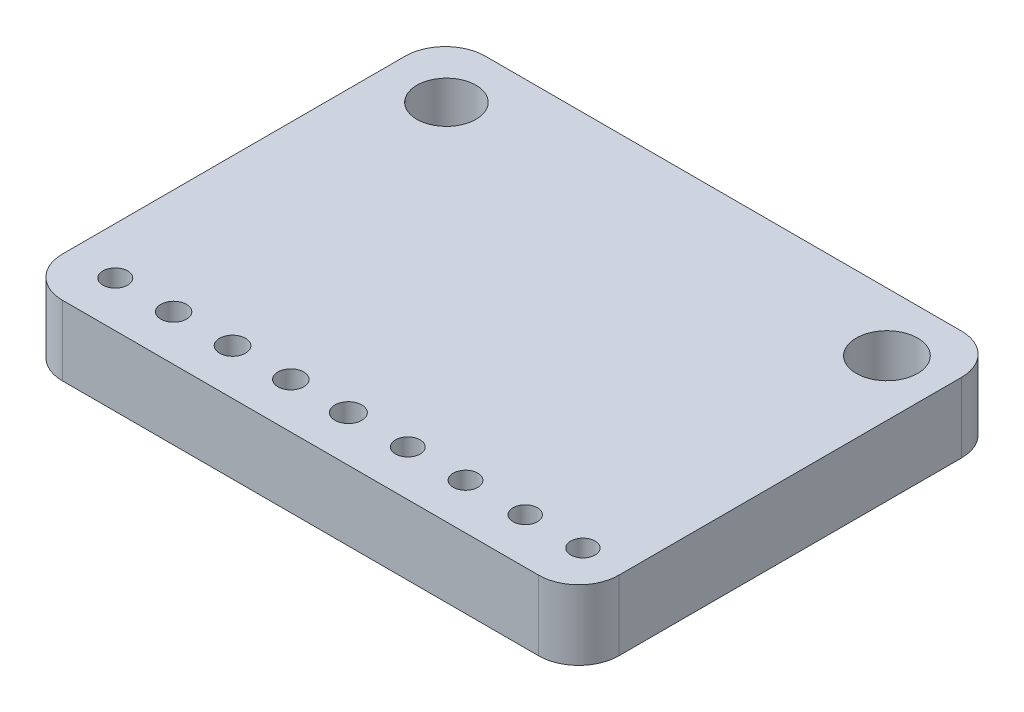
ISO-10303-21;
HEADER;
FILE_DESCRIPTION(('STEP AP214'),'2;1');
FILE_NAME('part.step','',(''),(''),'','','');
FILE_SCHEMA(('AUTOMOTIVE_DESIGN { 1 0 10303 214 1 1 1 1 }'));
ENDSEC;
DATA;
#1=APPLICATION_CONTEXT('core data for automotive mechanical design processes');
#2=APPLICATION_PROTOCOL_DEFINITION('international standard','automotive_design',2000,#1);
#3=PRODUCT_CONTEXT('',#1,'mechanical');
#4=PRODUCT('Part','Part','',(#3));
#5=PRODUCT_RELATED_PRODUCT_CATEGORY('part','',(#4));
#6=PRODUCT_DEFINITION_FORMATION('','',#4);
#7=PRODUCT_DEFINITION_CONTEXT('part definition',#1,'design');
#8=PRODUCT_DEFINITION('design','',#6,#7);
#9=PRODUCT_DEFINITION_SHAPE('','',#8);
#10=(LENGTH_UNIT() NAMED_UNIT(*) SI_UNIT(.MILLI.,.METRE.));
#11=(NAMED_UNIT(*) PLANE_ANGLE_UNIT() SI_UNIT($,.RADIAN.));
#12=(NAMED_UNIT(*) SI_UNIT($,.STERADIAN.) SOLID_ANGLE_UNIT());
#13=UNCERTAINTY_MEASURE_WITH_UNIT(LENGTH_MEASURE(1.E-05),#10,'distance_accuracy_value','');
#14=(GEOMETRIC_REPRESENTATION_CONTEXT(3) GLOBAL_UNCERTAINTY_ASSIGNED_CONTEXT((#13)) GLOBAL_UNIT_ASSIGNED_CONTEXT((#10,
#11,#12)) REPRESENTATION_CONTEXT('',''));
#15=CARTESIAN_POINT('',(0.,0.,0.));
#16=DIRECTION('',(0.,0.,1.));
#17=DIRECTION('',(1.,0.,0.));
#18=AXIS2_PLACEMENT_3D('',#15,#16,#17);
#19=CARTESIAN_POINT('',(0.,3.14,0.));
#20=DIRECTION('',(1.,0.,0.));
#21=DIRECTION('',(0.,0.,-1.));
#22=AXIS2_PLACEMENT_3D('',#19,#20,#21);
#23=PLANE('',#22);
#24=DIRECTION('',(0.,0.,1.));
#25=VECTOR('',#24,1.);
#26=CARTESIAN_POINT('',(0.,0.,0.));
#27=LINE('',#26,#25);
#28=CARTESIAN_POINT('',(0.,0.,-17.2));
#29=VERTEX_POINT('',#28);
#30=CARTESIAN_POINT('',(0.,0.,-1.8));
#31=VERTEX_POINT('',#30);
#32=EDGE_CURVE('E133',#29,#31,#27,.T.);
#33=ORIENTED_EDGE('',*,*,#32,.T.);
#34=DIRECTION('',(0.,-1.,0.));
#35=VECTOR('',#34,1.);
#36=CARTESIAN_POINT('',(0.,3.14,-1.8));
#37=LINE('',#36,#35);
#38=CARTESIAN_POINT('',(0.,3.14,-1.8));
#39=VERTEX_POINT('',#38);
#40=EDGE_CURVE('E156',#31,#39,#37,.F.);
#41=ORIENTED_EDGE('',*,*,#40,.T.);
#42=DIRECTION('',(0.,0.,1.));
#43=VECTOR('',#42,1.);
#44=CARTESIAN_POINT('',(0.,3.14,0.));
#45=LINE('',#44,#43);
#46=CARTESIAN_POINT('',(0.,3.14,-17.2));
#47=VERTEX_POINT('',#46);
#48=EDGE_CURVE('E131',#47,#39,#45,.T.);
#49=ORIENTED_EDGE('',*,*,#48,.F.);
#50=DIRECTION('',(0.,-1.,0.));
#51=VECTOR('',#50,1.);
#52=CARTESIAN_POINT('',(0.,3.14,-17.2));
#53=LINE('',#52,#51);
#54=EDGE_CURVE('E153',#47,#29,#53,.T.);
#55=ORIENTED_EDGE('',*,*,#54,.T.);
#56=EDGE_LOOP('',(#33,#41,#49,#55));
#57=FACE_BOUND('',#56,.T.);
#58=ADVANCED_FACE('F38',(#57),#23,.F.);
#59=CARTESIAN_POINT('',(0.,3.14,0.));
#60=DIRECTION('',(0.,0.,-1.));
#61=DIRECTION('',(-1.,0.,0.));
#62=AXIS2_PLACEMENT_3D('',#59,#60,#61);
#63=PLANE('',#62);
#64=DIRECTION('',(1.,0.,0.));
#65=VECTOR('',#64,1.);
#66=CARTESIAN_POINT('',(0.,0.,0.));
#67=LINE('',#66,#65);
#68=CARTESIAN_POINT('',(1.8,0.,0.));
#69=VERTEX_POINT('',#68);
#70=CARTESIAN_POINT('',(23.2,0.,0.));
#71=VERTEX_POINT('',#70);
#72=EDGE_CURVE('E129',#69,#71,#67,.T.);
#73=ORIENTED_EDGE('',*,*,#72,.T.);
#74=DIRECTION('',(0.,-1.,0.));
#75=VECTOR('',#74,1.);
#76=CARTESIAN_POINT('',(23.2,3.14,0.));
#77=LINE('',#76,#75);
#78=CARTESIAN_POINT('',(23.2,3.14,0.));
#79=VERTEX_POINT('',#78);
#80=EDGE_CURVE('E108',#71,#79,#77,.F.);
#81=ORIENTED_EDGE('',*,*,#80,.T.);
#82=DIRECTION('',(1.,0.,0.));
#83=VECTOR('',#82,1.);
#84=CARTESIAN_POINT('',(0.,3.14,0.));
#85=LINE('',#84,#83);
#86=CARTESIAN_POINT('',(1.8,3.14,0.));
#87=VERTEX_POINT('',#86);
#88=EDGE_CURVE('E172',#87,#79,#85,.T.);
#89=ORIENTED_EDGE('',*,*,#88,.F.);
#90=DIRECTION('',(0.,-1.,0.));
#91=VECTOR('',#90,1.);
#92=CARTESIAN_POINT('',(1.8,3.14,0.));
#93=LINE('',#92,#91);
#94=EDGE_CURVE('E113',#87,#69,#93,.T.);
#95=ORIENTED_EDGE('',*,*,#94,.T.);
#96=EDGE_LOOP('',(#73,#81,#89,#95));
#97=FACE_BOUND('',#96,.T.);
#98=ADVANCED_FACE('F283',(#97),#63,.F.);
#99=CARTESIAN_POINT('',(25.,3.14,0.));
#100=DIRECTION('',(-1.,0.,0.));
#101=DIRECTION('',(0.,0.,1.));
#102=AXIS2_PLACEMENT_3D('',#99,#100,#101);
#103=PLANE('',#102);
#104=DIRECTION('',(0.,0.,-1.));
#105=VECTOR('',#104,1.);
#106=CARTESIAN_POINT('',(25.,3.14,0.));
#107=LINE('',#106,#105);
#108=CARTESIAN_POINT('',(25.,3.14,-1.8));
#109=VERTEX_POINT('',#108);
#110=CARTESIAN_POINT('',(25.,3.14,-17.2));
#111=VERTEX_POINT('',#110);
#112=EDGE_CURVE('E122',#109,#111,#107,.T.);
#113=ORIENTED_EDGE('',*,*,#112,.F.);
#114=DIRECTION('',(0.,-1.,0.));
#115=VECTOR('',#114,1.);
#116=CARTESIAN_POINT('',(25.,3.14,-1.8));
#117=LINE('',#116,#115);
#118=CARTESIAN_POINT('',(25.,0.,-1.8));
#119=VERTEX_POINT('',#118);
#120=EDGE_CURVE('E107',#109,#119,#117,.T.);
#121=ORIENTED_EDGE('',*,*,#120,.T.);
#122=DIRECTION('',(0.,0.,-1.));
#123=VECTOR('',#122,1.);
#124=CARTESIAN_POINT('',(25.,0.,0.));
#125=LINE('',#124,#123);
#126=CARTESIAN_POINT('',(25.,0.,-17.2));
#127=VERTEX_POINT('',#126);
#128=EDGE_CURVE('E120',#119,#127,#125,.T.);
#129=ORIENTED_EDGE('',*,*,#128,.T.);
#130=DIRECTION('',(0.,-1.,0.));
#131=VECTOR('',#130,1.);
#132=CARTESIAN_POINT('',(25.,3.14,-17.2));
#133=LINE('',#132,#131);
#134=EDGE_CURVE('E124',#127,#111,#133,.F.);
#135=ORIENTED_EDGE('',*,*,#134,.T.);
#136=EDGE_LOOP('',(#113,#121,#129,#135));
#137=FACE_BOUND('',#136,.T.);
#138=ADVANCED_FACE('F119',(#137),#103,.F.);
#139=CARTESIAN_POINT('',(0.,3.14,-19.));
#140=DIRECTION('',(0.,0.,1.));
#141=DIRECTION('',(1.,0.,0.));
#142=AXIS2_PLACEMENT_3D('',#139,#140,#141);
#143=PLANE('',#142);
#144=DIRECTION('',(-1.,0.,0.));
#145=VECTOR('',#144,1.);
#146=CARTESIAN_POINT('',(0.,0.,-19.));
#147=LINE('',#146,#145);
#148=CARTESIAN_POINT('',(23.2,0.,-19.));
#149=VERTEX_POINT('',#148);
#150=CARTESIAN_POINT('',(1.8,0.,-19.));
#151=VERTEX_POINT('',#150);
#152=EDGE_CURVE('E128',#149,#151,#147,.T.);
#153=ORIENTED_EDGE('',*,*,#152,.T.);
#154=DIRECTION('',(0.,-1.,0.));
#155=VECTOR('',#154,1.);
#156=CARTESIAN_POINT('',(1.8,3.14,-19.));
#157=LINE('',#156,#155);
#158=CARTESIAN_POINT('',(1.8,3.14,-19.));
#159=VERTEX_POINT('',#158);
#160=EDGE_CURVE('E11',#151,#159,#157,.F.);
#161=ORIENTED_EDGE('',*,*,#160,.T.);
#162=DIRECTION('',(-1.,0.,0.));
#163=VECTOR('',#162,1.);
#164=CARTESIAN_POINT('',(0.,3.14,-19.));
#165=LINE('',#164,#163);
#166=CARTESIAN_POINT('',(23.2,3.14,-19.));
#167=VERTEX_POINT('',#166);
#168=EDGE_CURVE('E137',#167,#159,#165,.T.);
#169=ORIENTED_EDGE('',*,*,#168,.F.);
#170=DIRECTION('',(0.,-1.,0.));
#171=VECTOR('',#170,1.);
#172=CARTESIAN_POINT('',(23.2,3.14,-19.));
#173=LINE('',#172,#171);
#174=EDGE_CURVE('E46',#167,#149,#173,.T.);
#175=ORIENTED_EDGE('',*,*,#174,.T.);
#176=EDGE_LOOP('',(#153,#161,#169,#175));
#177=FACE_BOUND('',#176,.T.);
#178=ADVANCED_FACE('F159',(#177),#143,.F.);
#179=CARTESIAN_POINT('',(0.,3.14,0.));
#180=DIRECTION('',(0.,-1.,0.));
#181=DIRECTION('',(0.,0.,-1.));
#182=AXIS2_PLACEMENT_3D('',#179,#180,#181);
#183=PLANE('',#182);
#184=CARTESIAN_POINT('',(20.54363006269,3.14,-2.05046074015058));
#185=DIRECTION('',(0.,1.,0.));
#186=DIRECTION('',(0.,0.,1.));
#187=AXIS2_PLACEMENT_3D('',#184,#185,#186);
#188=CIRCLE('',#187,0.547156774173834);
#189=CARTESIAN_POINT('',(20.54363006269,3.14,-1.50330396597675));
#190=VERTEX_POINT('',#189);
#191=EDGE_CURVE('E242',#190,#190,#188,.T.);
#192=ORIENTED_EDGE('',*,*,#191,.F.);
#193=EDGE_LOOP('',(#192));
#194=FACE_BOUND('',#193,.T.);
#195=CARTESIAN_POINT('',(17.8608993341385,3.14,-2.05046074015058));
#196=DIRECTION('',(0.,1.,0.));
#197=DIRECTION('',(0.,0.,1.));
#198=AXIS2_PLACEMENT_3D('',#195,#196,#197);
#199=CIRCLE('',#198,0.553895188212355);
#200=CARTESIAN_POINT('',(17.8608993341385,3.14,-1.49656555193823));
#201=VERTEX_POINT('',#200);
#202=EDGE_CURVE('E236',#201,#201,#199,.T.);
#203=ORIENTED_EDGE('',*,*,#202,.F.);
#204=EDGE_LOOP('',(#203));
#205=FACE_BOUND('',#204,.T.);
#206=CARTESIAN_POINT('',(15.268099294417,3.14,-2.05046074015058));
#207=DIRECTION('',(0.,1.,0.));
#208=DIRECTION('',(0.,0.,1.));
#209=AXIS2_PLACEMENT_3D('',#206,#207,#208);
#210=CIRCLE('',#209,0.554442321512716);
#211=CARTESIAN_POINT('',(15.268099294417,3.14,-1.49601841863787));
#212=VERTEX_POINT('',#211);
#213=EDGE_CURVE('E230',#212,#212,#210,.T.);
#214=ORIENTED_EDGE('',*,*,#213,.F.);
#215=EDGE_LOOP('',(#214));
#216=FACE_BOUND('',#215,.T.);
#217=CARTESIAN_POINT('',(12.597553851279,3.14,-2.05046074015058));
#218=DIRECTION('',(0.,1.,0.));
#219=DIRECTION('',(0.,0.,1.));
#220=AXIS2_PLACEMENT_3D('',#217,#218,#219);
#221=CIRCLE('',#220,0.602582449942355);
#222=CARTESIAN_POINT('',(12.597553851279,3.14,-1.44787829020823));
#223=VERTEX_POINT('',#222);
#224=EDGE_CURVE('E224',#223,#223,#221,.T.);
#225=ORIENTED_EDGE('',*,*,#224,.F.);
#226=EDGE_LOOP('',(#225));
#227=FACE_BOUND('',#226,.T.);
#228=CARTESIAN_POINT('',(10.0100261186995,3.14,-2.05046074015058));
#229=DIRECTION('',(0.,1.,0.));
#230=DIRECTION('',(0.,0.,1.));
#231=AXIS2_PLACEMENT_3D('',#228,#229,#230);
#232=CIRCLE('',#231,0.580608074066902);
#233=CARTESIAN_POINT('',(10.0100261186995,3.14,-1.46985266608368));
#234=VERTEX_POINT('',#233);
#235=EDGE_CURVE('E218',#234,#234,#232,.T.);
#236=ORIENTED_EDGE('',*,*,#235,.F.);
#237=EDGE_LOOP('',(#236));
#238=FACE_BOUND('',#237,.T.);
#239=CARTESIAN_POINT('',(7.39036478343991,3.14,-2.05046074015058));
#240=DIRECTION('',(0.,1.,0.));
#241=DIRECTION('',(0.,0.,1.));
#242=AXIS2_PLACEMENT_3D('',#239,#240,#241);
#243=CIRCLE('',#242,0.583065551730045);
#244=CARTESIAN_POINT('',(7.39036478343991,3.14,-1.46739518842054));
#245=VERTEX_POINT('',#244);
#246=EDGE_CURVE('E212',#245,#245,#243,.T.);
#247=ORIENTED_EDGE('',*,*,#246,.F.);
#248=EDGE_LOOP('',(#247));
#249=FACE_BOUND('',#248,.T.);
#250=CARTESIAN_POINT('',(4.74482030796963,3.14,-2.05046074015058));
#251=DIRECTION('',(0.,1.,0.));
#252=DIRECTION('',(0.,0.,1.));
#253=AXIS2_PLACEMENT_3D('',#250,#251,#252);
#254=CIRCLE('',#253,0.578153997931779);
#255=CARTESIAN_POINT('',(4.74482030796963,3.14,-1.4723067422188));
#256=VERTEX_POINT('',#255);
#257=EDGE_CURVE('E206',#256,#256,#254,.T.);
#258=ORIENTED_EDGE('',*,*,#257,.F.);
#259=EDGE_LOOP('',(#258));
#260=FACE_BOUND('',#259,.T.);
#261=CARTESIAN_POINT('',(2.12136598787538,3.14,-2.05046074015058));
#262=DIRECTION('',(0.,1.,0.));
#263=DIRECTION('',(0.,0.,1.));
#264=AXIS2_PLACEMENT_3D('',#261,#262,#263);
#265=CIRCLE('',#264,0.55656492037272);
#266=CARTESIAN_POINT('',(2.12136598787538,3.14,-1.49389581977786));
#267=VERTEX_POINT('',#266);
#268=EDGE_CURVE('E200',#267,#267,#265,.T.);
#269=ORIENTED_EDGE('',*,*,#268,.F.);
#270=EDGE_LOOP('',(#269));
#271=FACE_BOUND('',#270,.T.);
#272=CARTESIAN_POINT('',(23.1371451607032,3.14,-2.05046074015058));
#273=DIRECTION('',(0.,1.,0.));
#274=DIRECTION('',(0.,0.,1.));
#275=AXIS2_PLACEMENT_3D('',#272,#273,#274);
#276=CIRCLE('',#275,0.546420727418179);
#277=CARTESIAN_POINT('',(23.1371451607032,3.14,-1.5040400127324));
#278=VERTEX_POINT('',#277);
#279=EDGE_CURVE('E194',#278,#278,#276,.T.);
#280=ORIENTED_EDGE('',*,*,#279,.F.);
#281=EDGE_LOOP('',(#280));
#282=FACE_BOUND('',#281,.T.);
#283=CARTESIAN_POINT('',(22.4837391061996,3.14,-16.3647977935533));
#284=DIRECTION('',(0.,1.,0.));
#285=DIRECTION('',(0.,0.,1.));
#286=AXIS2_PLACEMENT_3D('',#283,#284,#285);
#287=CIRCLE('',#286,1.3790795967696);
#288=CARTESIAN_POINT('',(22.4837391061996,3.14,-14.9857181967837));
#289=VERTEX_POINT('',#288);
#290=EDGE_CURVE('E188',#289,#289,#287,.T.);
#291=ORIENTED_EDGE('',*,*,#290,.F.);
#292=EDGE_LOOP('',(#291));
#293=FACE_BOUND('',#292,.T.);
#294=CARTESIAN_POINT('',(2.72259463354414,3.14,-16.3314363215997));
#295=DIRECTION('',(0.,1.,0.));
#296=DIRECTION('',(0.,0.,1.));
#297=AXIS2_PLACEMENT_3D('',#294,#295,#296);
#298=CIRCLE('',#297,1.32870315723417);
#299=CARTESIAN_POINT('',(2.72259463354414,3.14,-15.0027331643656));
#300=VERTEX_POINT('',#299);
#301=EDGE_CURVE('E177',#300,#300,#298,.T.);
#302=ORIENTED_EDGE('',*,*,#301,.F.);
#303=EDGE_LOOP('',(#302));
#304=FACE_BOUND('',#303,.T.);
#305=ORIENTED_EDGE('',*,*,#88,.T.);
#306=CARTESIAN_POINT('',(23.2,3.14,-1.8));
#307=DIRECTION('',(0.,-1.,0.));
#308=DIRECTION('',(0.,0.,-1.));
#309=AXIS2_PLACEMENT_3D('',#306,#307,#308);
#310=CIRCLE('',#309,1.8);
#311=EDGE_CURVE('E151',#79,#109,#310,.F.);
#312=ORIENTED_EDGE('',*,*,#311,.T.);
#313=ORIENTED_EDGE('',*,*,#112,.T.);
#314=CARTESIAN_POINT('',(23.2,3.14,-17.2));
#315=DIRECTION('',(0.,-1.,0.));
#316=DIRECTION('',(0.,0.,-1.));
#317=AXIS2_PLACEMENT_3D('',#314,#315,#316);
#318=CIRCLE('',#317,1.8);
#319=EDGE_CURVE('E58',#111,#167,#318,.F.);
#320=ORIENTED_EDGE('',*,*,#319,.T.);
#321=ORIENTED_EDGE('',*,*,#168,.T.);
#322=CARTESIAN_POINT('',(1.8,3.14,-17.2));
#323=DIRECTION('',(0.,-1.,0.));
#324=DIRECTION('',(0.,0.,-1.));
#325=AXIS2_PLACEMENT_3D('',#322,#323,#324);
#326=CIRCLE('',#325,1.8);
#327=EDGE_CURVE('E147',#159,#47,#326,.F.);
#328=ORIENTED_EDGE('',*,*,#327,.T.);
#329=ORIENTED_EDGE('',*,*,#48,.T.);
#330=CARTESIAN_POINT('',(1.8,3.14,-1.8));
#331=DIRECTION('',(0.,-1.,0.));
#332=DIRECTION('',(0.,0.,-1.));
#333=AXIS2_PLACEMENT_3D('',#330,#331,#332);
#334=CIRCLE('',#333,1.8);
#335=EDGE_CURVE('E149',#39,#87,#334,.F.);
#336=ORIENTED_EDGE('',*,*,#335,.T.);
#337=EDGE_LOOP('',(#305,#312,#313,#320,#321,#328,#329,#336));
#338=FACE_BOUND('',#337,.T.);
#339=ADVANCED_FACE('F257',(#194,#205,#216,#227,#238,#249,#260,#271,#282,#293,#304,#338),#183,.F.);
#340=CARTESIAN_POINT('',(0.,0.,0.));
#341=DIRECTION('',(0.,-1.,0.));
#342=DIRECTION('',(0.,0.,-1.));
#343=AXIS2_PLACEMENT_3D('',#340,#341,#342);
#344=PLANE('',#343);
#345=CARTESIAN_POINT('',(20.54363006269,0.,-2.05046074015058));
#346=DIRECTION('',(0.,1.,0.));
#347=DIRECTION('',(0.,0.,1.));
#348=AXIS2_PLACEMENT_3D('',#345,#346,#347);
#349=CIRCLE('',#348,0.547156774173834);
#350=CARTESIAN_POINT('',(20.54363006269,0.,-1.50330396597675));
#351=VERTEX_POINT('',#350);
#352=EDGE_CURVE('E197',#351,#351,#349,.T.);
#353=ORIENTED_EDGE('',*,*,#352,.T.);
#354=EDGE_LOOP('',(#353));
#355=FACE_BOUND('',#354,.T.);
#356=CARTESIAN_POINT('',(17.8608993341385,0.,-2.05046074015058));
#357=DIRECTION('',(0.,1.,0.));
#358=DIRECTION('',(0.,0.,1.));
#359=AXIS2_PLACEMENT_3D('',#356,#357,#358);
#360=CIRCLE('',#359,0.553895188212355);
#361=CARTESIAN_POINT('',(17.8608993341385,0.,-1.49656555193823));
#362=VERTEX_POINT('',#361);
#363=EDGE_CURVE('E239',#362,#362,#360,.T.);
#364=ORIENTED_EDGE('',*,*,#363,.T.);
#365=EDGE_LOOP('',(#364));
#366=FACE_BOUND('',#365,.T.);
#367=CARTESIAN_POINT('',(15.268099294417,0.,-2.05046074015058));
#368=DIRECTION('',(0.,1.,0.));
#369=DIRECTION('',(0.,0.,1.));
#370=AXIS2_PLACEMENT_3D('',#367,#368,#369);
#371=CIRCLE('',#370,0.554442321512716);
#372=CARTESIAN_POINT('',(15.268099294417,0.,-1.49601841863787));
#373=VERTEX_POINT('',#372);
#374=EDGE_CURVE('E233',#373,#373,#371,.T.);
#375=ORIENTED_EDGE('',*,*,#374,.T.);
#376=EDGE_LOOP('',(#375));
#377=FACE_BOUND('',#376,.T.);
#378=CARTESIAN_POINT('',(12.597553851279,0.,-2.05046074015058));
#379=DIRECTION('',(0.,1.,0.));
#380=DIRECTION('',(0.,0.,1.));
#381=AXIS2_PLACEMENT_3D('',#378,#379,#380);
#382=CIRCLE('',#381,0.602582449942355);
#383=CARTESIAN_POINT('',(12.597553851279,0.,-1.44787829020823));
#384=VERTEX_POINT('',#383);
#385=EDGE_CURVE('E227',#384,#384,#382,.T.);
#386=ORIENTED_EDGE('',*,*,#385,.T.);
#387=EDGE_LOOP('',(#386));
#388=FACE_BOUND('',#387,.T.);
#389=CARTESIAN_POINT('',(10.0100261186995,0.,-2.05046074015058));
#390=DIRECTION('',(0.,1.,0.));
#391=DIRECTION('',(0.,0.,1.));
#392=AXIS2_PLACEMENT_3D('',#389,#390,#391);
#393=CIRCLE('',#392,0.580608074066902);
#394=CARTESIAN_POINT('',(10.0100261186995,0.,-1.46985266608368));
#395=VERTEX_POINT('',#394);
#396=EDGE_CURVE('E221',#395,#395,#393,.T.);
#397=ORIENTED_EDGE('',*,*,#396,.T.);
#398=EDGE_LOOP('',(#397));
#399=FACE_BOUND('',#398,.T.);
#400=CARTESIAN_POINT('',(7.39036478343991,0.,-2.05046074015058));
#401=DIRECTION('',(0.,1.,0.));
#402=DIRECTION('',(0.,0.,1.));
#403=AXIS2_PLACEMENT_3D('',#400,#401,#402);
#404=CIRCLE('',#403,0.583065551730045);
#405=CARTESIAN_POINT('',(7.39036478343991,0.,-1.46739518842054));
#406=VERTEX_POINT('',#405);
#407=EDGE_CURVE('E215',#406,#406,#404,.T.);
#408=ORIENTED_EDGE('',*,*,#407,.T.);
#409=EDGE_LOOP('',(#408));
#410=FACE_BOUND('',#409,.T.);
#411=CARTESIAN_POINT('',(4.74482030796963,0.,-2.05046074015058));
#412=DIRECTION('',(0.,1.,0.));
#413=DIRECTION('',(0.,0.,1.));
#414=AXIS2_PLACEMENT_3D('',#411,#412,#413);
#415=CIRCLE('',#414,0.578153997931779);
#416=CARTESIAN_POINT('',(4.74482030796963,0.,-1.4723067422188));
#417=VERTEX_POINT('',#416);
#418=EDGE_CURVE('E209',#417,#417,#415,.T.);
#419=ORIENTED_EDGE('',*,*,#418,.T.);
#420=EDGE_LOOP('',(#419));
#421=FACE_BOUND('',#420,.T.);
#422=CARTESIAN_POINT('',(2.12136598787538,0.,-2.05046074015058));
#423=DIRECTION('',(0.,1.,0.));
#424=DIRECTION('',(0.,0.,1.));
#425=AXIS2_PLACEMENT_3D('',#422,#423,#424);
#426=CIRCLE('',#425,0.55656492037272);
#427=CARTESIAN_POINT('',(2.12136598787538,0.,-1.49389581977786));
#428=VERTEX_POINT('',#427);
#429=EDGE_CURVE('E203',#428,#428,#426,.T.);
#430=ORIENTED_EDGE('',*,*,#429,.T.);
#431=EDGE_LOOP('',(#430));
#432=FACE_BOUND('',#431,.T.);
#433=CARTESIAN_POINT('',(23.1371451607032,0.,-2.05046074015058));
#434=DIRECTION('',(0.,1.,0.));
#435=DIRECTION('',(0.,0.,1.));
#436=AXIS2_PLACEMENT_3D('',#433,#434,#435);
#437=CIRCLE('',#436,0.546420727418179);
#438=CARTESIAN_POINT('',(23.1371451607032,0.,-1.5040400127324));
#439=VERTEX_POINT('',#438);
#440=EDGE_CURVE('E191',#439,#439,#437,.T.);
#441=ORIENTED_EDGE('',*,*,#440,.T.);
#442=EDGE_LOOP('',(#441));
#443=FACE_BOUND('',#442,.T.);
#444=CARTESIAN_POINT('',(22.4837391061996,0.,-16.3647977935533));
#445=DIRECTION('',(0.,1.,0.));
#446=DIRECTION('',(0.,0.,1.));
#447=AXIS2_PLACEMENT_3D('',#444,#445,#446);
#448=CIRCLE('',#447,1.3790795967696);
#449=CARTESIAN_POINT('',(22.4837391061996,0.,-14.9857181967837));
#450=VERTEX_POINT('',#449);
#451=EDGE_CURVE('E186',#450,#450,#448,.T.);
#452=ORIENTED_EDGE('',*,*,#451,.T.);
#453=EDGE_LOOP('',(#452));
#454=FACE_BOUND('',#453,.T.);
#455=CARTESIAN_POINT('',(2.72259463354414,0.,-16.3314363215997));
#456=DIRECTION('',(0.,1.,0.));
#457=DIRECTION('',(0.,0.,1.));
#458=AXIS2_PLACEMENT_3D('',#455,#456,#457);
#459=CIRCLE('',#458,1.32870315723417);
#460=CARTESIAN_POINT('',(2.72259463354414,0.,-15.0027331643656));
#461=VERTEX_POINT('',#460);
#462=EDGE_CURVE('E181',#461,#461,#459,.T.);
#463=ORIENTED_EDGE('',*,*,#462,.T.);
#464=EDGE_LOOP('',(#463));
#465=FACE_BOUND('',#464,.T.);
#466=ORIENTED_EDGE('',*,*,#128,.F.);
#467=CARTESIAN_POINT('',(23.2,0.,-1.8));
#468=DIRECTION('',(0.,-1.,0.));
#469=DIRECTION('',(0.,0.,-1.));
#470=AXIS2_PLACEMENT_3D('',#467,#468,#469);
#471=CIRCLE('',#470,1.8);
#472=EDGE_CURVE('E103',#119,#71,#471,.T.);
#473=ORIENTED_EDGE('',*,*,#472,.T.);
#474=ORIENTED_EDGE('',*,*,#72,.F.);
#475=CARTESIAN_POINT('',(1.8,0.,-1.8));
#476=DIRECTION('',(0.,-1.,0.));
#477=DIRECTION('',(0.,0.,-1.));
#478=AXIS2_PLACEMENT_3D('',#475,#476,#477);
#479=CIRCLE('',#478,1.8);
#480=EDGE_CURVE('E114',#69,#31,#479,.T.);
#481=ORIENTED_EDGE('',*,*,#480,.T.);
#482=ORIENTED_EDGE('',*,*,#32,.F.);
#483=CARTESIAN_POINT('',(1.8,0.,-17.2));
#484=DIRECTION('',(0.,-1.,0.));
#485=DIRECTION('',(0.,0.,-1.));
#486=AXIS2_PLACEMENT_3D('',#483,#484,#485);
#487=CIRCLE('',#486,1.8);
#488=EDGE_CURVE('E140',#29,#151,#487,.T.);
#489=ORIENTED_EDGE('',*,*,#488,.T.);
#490=ORIENTED_EDGE('',*,*,#152,.F.);
#491=CARTESIAN_POINT('',(23.2,0.,-17.2));
#492=DIRECTION('',(0.,-1.,0.));
#493=DIRECTION('',(0.,0.,-1.));
#494=AXIS2_PLACEMENT_3D('',#491,#492,#493);
#495=CIRCLE('',#494,1.8);
#496=EDGE_CURVE('E123',#149,#127,#495,.T.);
#497=ORIENTED_EDGE('',*,*,#496,.T.);
#498=EDGE_LOOP('',(#466,#473,#474,#481,#482,#489,#490,#497));
#499=FACE_BOUND('',#498,.T.);
#500=ADVANCED_FACE('F126',(#355,#366,#377,#388,#399,#410,#421,#432,#443,#454,#465,#499),#344,.T.);
#501=CARTESIAN_POINT('',(2.72259463354414,0.,-16.3314363215997));
#502=DIRECTION('',(0.,1.,0.));
#503=DIRECTION('',(0.,0.,1.));
#504=AXIS2_PLACEMENT_3D('',#501,#502,#503);
#505=CYLINDRICAL_SURFACE('',#504,1.32870315723417);
#506=ORIENTED_EDGE('',*,*,#462,.F.);
#507=EDGE_LOOP('',(#506));
#508=FACE_BOUND('',#507,.T.);
#509=ORIENTED_EDGE('',*,*,#301,.T.);
#510=EDGE_LOOP('',(#509));
#511=FACE_BOUND('',#510,.T.);
#512=ADVANCED_FACE('F305',(#508,#511),#505,.F.);
#513=CARTESIAN_POINT('',(22.4837391061996,0.,-16.3647977935533));
#514=DIRECTION('',(0.,1.,0.));
#515=DIRECTION('',(0.,0.,1.));
#516=AXIS2_PLACEMENT_3D('',#513,#514,#515);
#517=CYLINDRICAL_SURFACE('',#516,1.3790795967696);
#518=ORIENTED_EDGE('',*,*,#451,.F.);
#519=EDGE_LOOP('',(#518));
#520=FACE_BOUND('',#519,.T.);
#521=ORIENTED_EDGE('',*,*,#290,.T.);
#522=EDGE_LOOP('',(#521));
#523=FACE_BOUND('',#522,.T.);
#524=ADVANCED_FACE('F309',(#520,#523),#517,.F.);
#525=CARTESIAN_POINT('',(23.1371451607032,0.,-2.05046074015058));
#526=DIRECTION('',(0.,1.,0.));
#527=DIRECTION('',(0.,0.,1.));
#528=AXIS2_PLACEMENT_3D('',#525,#526,#527);
#529=CYLINDRICAL_SURFACE('',#528,0.546420727418179);
#530=ORIENTED_EDGE('',*,*,#440,.F.);
#531=EDGE_LOOP('',(#530));
#532=FACE_BOUND('',#531,.T.);
#533=ORIENTED_EDGE('',*,*,#279,.T.);
#534=EDGE_LOOP('',(#533));
#535=FACE_BOUND('',#534,.T.);
#536=ADVANCED_FACE('F313',(#532,#535),#529,.F.);
#537=CARTESIAN_POINT('',(2.12136598787538,0.,-2.05046074015058));
#538=DIRECTION('',(0.,1.,0.));
#539=DIRECTION('',(0.,0.,1.));
#540=AXIS2_PLACEMENT_3D('',#537,#538,#539);
#541=CYLINDRICAL_SURFACE('',#540,0.55656492037272);
#542=ORIENTED_EDGE('',*,*,#429,.F.);
#543=EDGE_LOOP('',(#542));
#544=FACE_BOUND('',#543,.T.);
#545=ORIENTED_EDGE('',*,*,#268,.T.);
#546=EDGE_LOOP('',(#545));
#547=FACE_BOUND('',#546,.T.);
#548=ADVANCED_FACE('F317',(#544,#547),#541,.F.);
#549=CARTESIAN_POINT('',(4.74482030796963,0.,-2.05046074015058));
#550=DIRECTION('',(0.,1.,0.));
#551=DIRECTION('',(0.,0.,1.));
#552=AXIS2_PLACEMENT_3D('',#549,#550,#551);
#553=CYLINDRICAL_SURFACE('',#552,0.578153997931779);
#554=ORIENTED_EDGE('',*,*,#418,.F.);
#555=EDGE_LOOP('',(#554));
#556=FACE_BOUND('',#555,.T.);
#557=ORIENTED_EDGE('',*,*,#257,.T.);
#558=EDGE_LOOP('',(#557));
#559=FACE_BOUND('',#558,.T.);
#560=ADVANCED_FACE('F321',(#556,#559),#553,.F.);
#561=CARTESIAN_POINT('',(7.39036478343991,0.,-2.05046074015058));
#562=DIRECTION('',(0.,1.,0.));
#563=DIRECTION('',(0.,0.,1.));
#564=AXIS2_PLACEMENT_3D('',#561,#562,#563);
#565=CYLINDRICAL_SURFACE('',#564,0.583065551730045);
#566=ORIENTED_EDGE('',*,*,#407,.F.);
#567=EDGE_LOOP('',(#566));
#568=FACE_BOUND('',#567,.T.);
#569=ORIENTED_EDGE('',*,*,#246,.T.);
#570=EDGE_LOOP('',(#569));
#571=FACE_BOUND('',#570,.T.);
#572=ADVANCED_FACE('F325',(#568,#571),#565,.F.);
#573=CARTESIAN_POINT('',(10.0100261186995,0.,-2.05046074015058));
#574=DIRECTION('',(0.,1.,0.));
#575=DIRECTION('',(0.,0.,1.));
#576=AXIS2_PLACEMENT_3D('',#573,#574,#575);
#577=CYLINDRICAL_SURFACE('',#576,0.580608074066902);
#578=ORIENTED_EDGE('',*,*,#396,.F.);
#579=EDGE_LOOP('',(#578));
#580=FACE_BOUND('',#579,.T.);
#581=ORIENTED_EDGE('',*,*,#235,.T.);
#582=EDGE_LOOP('',(#581));
#583=FACE_BOUND('',#582,.T.);
#584=ADVANCED_FACE('F329',(#580,#583),#577,.F.);
#585=CARTESIAN_POINT('',(12.597553851279,0.,-2.05046074015058));
#586=DIRECTION('',(0.,1.,0.));
#587=DIRECTION('',(0.,0.,1.));
#588=AXIS2_PLACEMENT_3D('',#585,#586,#587);
#589=CYLINDRICAL_SURFACE('',#588,0.602582449942355);
#590=ORIENTED_EDGE('',*,*,#385,.F.);
#591=EDGE_LOOP('',(#590));
#592=FACE_BOUND('',#591,.T.);
#593=ORIENTED_EDGE('',*,*,#224,.T.);
#594=EDGE_LOOP('',(#593));
#595=FACE_BOUND('',#594,.T.);
#596=ADVANCED_FACE('F333',(#592,#595),#589,.F.);
#597=CARTESIAN_POINT('',(15.268099294417,0.,-2.05046074015058));
#598=DIRECTION('',(0.,1.,0.));
#599=DIRECTION('',(0.,0.,1.));
#600=AXIS2_PLACEMENT_3D('',#597,#598,#599);
#601=CYLINDRICAL_SURFACE('',#600,0.554442321512716);
#602=ORIENTED_EDGE('',*,*,#374,.F.);
#603=EDGE_LOOP('',(#602));
#604=FACE_BOUND('',#603,.T.);
#605=ORIENTED_EDGE('',*,*,#213,.T.);
#606=EDGE_LOOP('',(#605));
#607=FACE_BOUND('',#606,.T.);
#608=ADVANCED_FACE('F337',(#604,#607),#601,.F.);
#609=CARTESIAN_POINT('',(17.8608993341385,0.,-2.05046074015058));
#610=DIRECTION('',(0.,1.,0.));
#611=DIRECTION('',(0.,0.,1.));
#612=AXIS2_PLACEMENT_3D('',#609,#610,#611);
#613=CYLINDRICAL_SURFACE('',#612,0.553895188212355);
#614=ORIENTED_EDGE('',*,*,#363,.F.);
#615=EDGE_LOOP('',(#614));
#616=FACE_BOUND('',#615,.T.);
#617=ORIENTED_EDGE('',*,*,#202,.T.);
#618=EDGE_LOOP('',(#617));
#619=FACE_BOUND('',#618,.T.);
#620=ADVANCED_FACE('F253',(#616,#619),#613,.F.);
#621=CARTESIAN_POINT('',(20.54363006269,0.,-2.05046074015058));
#622=DIRECTION('',(0.,1.,0.));
#623=DIRECTION('',(0.,0.,1.));
#624=AXIS2_PLACEMENT_3D('',#621,#622,#623);
#625=CYLINDRICAL_SURFACE('',#624,0.547156774173834);
#626=ORIENTED_EDGE('',*,*,#352,.F.);
#627=EDGE_LOOP('',(#626));
#628=FACE_BOUND('',#627,.T.);
#629=ORIENTED_EDGE('',*,*,#191,.T.);
#630=EDGE_LOOP('',(#629));
#631=FACE_BOUND('',#630,.T.);
#632=ADVANCED_FACE('F250',(#628,#631),#625,.F.);
#633=CARTESIAN_POINT('',(23.2,3.14,-1.8));
#634=DIRECTION('',(0.,-1.,0.));
#635=DIRECTION('',(0.,0.,-1.));
#636=AXIS2_PLACEMENT_3D('',#633,#634,#635);
#637=CYLINDRICAL_SURFACE('',#636,1.8);
#638=ORIENTED_EDGE('',*,*,#311,.F.);
#639=ORIENTED_EDGE('',*,*,#80,.F.);
#640=ORIENTED_EDGE('',*,*,#472,.F.);
#641=ORIENTED_EDGE('',*,*,#120,.F.);
#642=EDGE_LOOP('',(#638,#639,#640,#641));
#643=FACE_BOUND('',#642,.T.);
#644=ADVANCED_FACE('F106',(#643),#637,.T.);
#645=CARTESIAN_POINT('',(1.8,3.14,-1.8));
#646=DIRECTION('',(0.,-1.,0.));
#647=DIRECTION('',(0.,0.,-1.));
#648=AXIS2_PLACEMENT_3D('',#645,#646,#647);
#649=CYLINDRICAL_SURFACE('',#648,1.8);
#650=ORIENTED_EDGE('',*,*,#335,.F.);
#651=ORIENTED_EDGE('',*,*,#40,.F.);
#652=ORIENTED_EDGE('',*,*,#480,.F.);
#653=ORIENTED_EDGE('',*,*,#94,.F.);
#654=EDGE_LOOP('',(#650,#651,#652,#653));
#655=FACE_BOUND('',#654,.T.);
#656=ADVANCED_FACE('F285',(#655),#649,.T.);
#657=CARTESIAN_POINT('',(1.8,3.14,-17.2));
#658=DIRECTION('',(0.,-1.,0.));
#659=DIRECTION('',(0.,0.,-1.));
#660=AXIS2_PLACEMENT_3D('',#657,#658,#659);
#661=CYLINDRICAL_SURFACE('',#660,1.8);
#662=ORIENTED_EDGE('',*,*,#327,.F.);
#663=ORIENTED_EDGE('',*,*,#160,.F.);
#664=ORIENTED_EDGE('',*,*,#488,.F.);
#665=ORIENTED_EDGE('',*,*,#54,.F.);
#666=EDGE_LOOP('',(#662,#663,#664,#665));
#667=FACE_BOUND('',#666,.T.);
#668=ADVANCED_FACE('F166',(#667),#661,.T.);
#669=CARTESIAN_POINT('',(23.2,3.14,-17.2));
#670=DIRECTION('',(0.,-1.,0.));
#671=DIRECTION('',(0.,0.,-1.));
#672=AXIS2_PLACEMENT_3D('',#669,#670,#671);
#673=CYLINDRICAL_SURFACE('',#672,1.8);
#674=ORIENTED_EDGE('',*,*,#319,.F.);
#675=ORIENTED_EDGE('',*,*,#134,.F.);
#676=ORIENTED_EDGE('',*,*,#496,.F.);
#677=ORIENTED_EDGE('',*,*,#174,.F.);
#678=EDGE_LOOP('',(#674,#675,#676,#677));
#679=FACE_BOUND('',#678,.T.);
#680=ADVANCED_FACE('F40',(#679),#673,.T.);
#681=CLOSED_SHELL('',(#58,#98,#138,#178,#339,#500,#512,#524,#536,#548,#560,#572,#584,#596,#608,
#620,#632,#644,#656,#668,#680));
#682=MANIFOLD_SOLID_BREP('B2',#681);
#683=ADVANCED_BREP_SHAPE_REPRESENTATION('',(#18,#682),#14);
#684=SHAPE_DEFINITION_REPRESENTATION(#9,#683);
ENDSEC;
END-ISO-10303-21;
